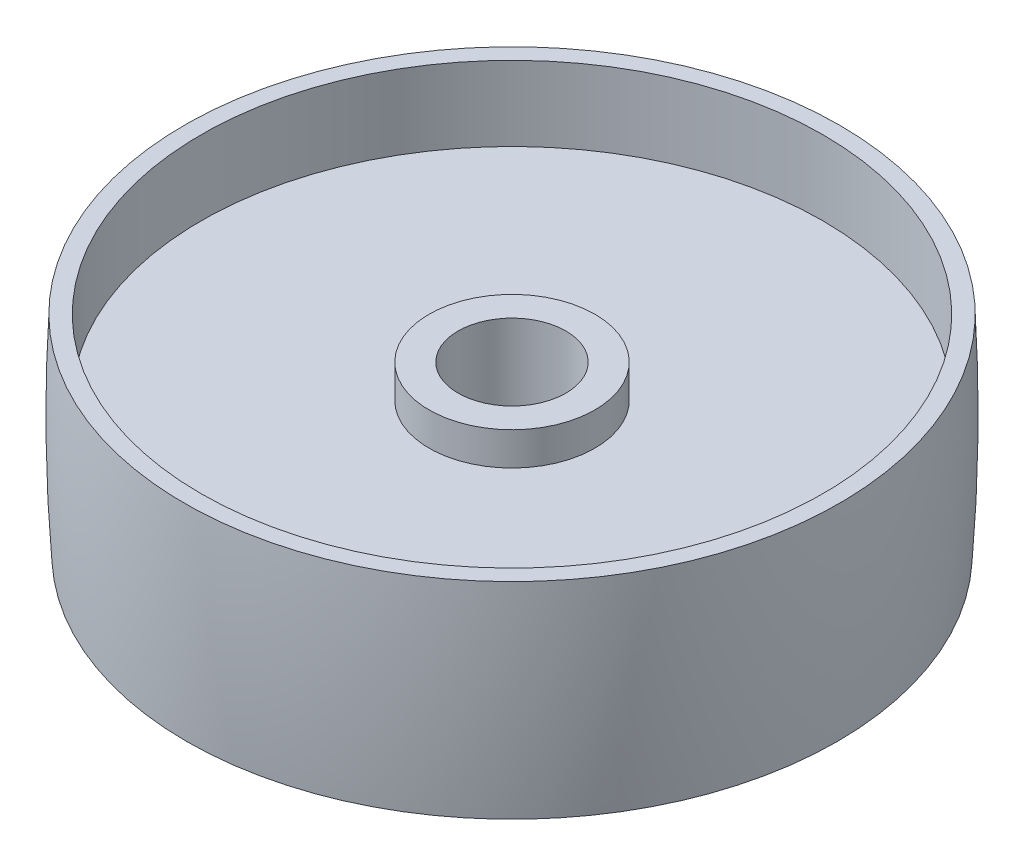
ISO-10303-21;
HEADER;
FILE_DESCRIPTION(('STEP AP214'),'2;1');
FILE_NAME('part.step','',(''),(''),'','','');
FILE_SCHEMA(('AUTOMOTIVE_DESIGN { 1 0 10303 214 1 1 1 1 }'));
ENDSEC;
DATA;
#1=APPLICATION_CONTEXT('core data for automotive mechanical design processes');
#2=APPLICATION_PROTOCOL_DEFINITION('international standard','automotive_design',2000,#1);
#3=PRODUCT_CONTEXT('',#1,'mechanical');
#4=PRODUCT('Part','Part','',(#3));
#5=PRODUCT_RELATED_PRODUCT_CATEGORY('part','',(#4));
#6=PRODUCT_DEFINITION_FORMATION('','',#4);
#7=PRODUCT_DEFINITION_CONTEXT('part definition',#1,'design');
#8=PRODUCT_DEFINITION('design','',#6,#7);
#9=PRODUCT_DEFINITION_SHAPE('','',#8);
#10=(LENGTH_UNIT() NAMED_UNIT(*) SI_UNIT(.MILLI.,.METRE.));
#11=(NAMED_UNIT(*) PLANE_ANGLE_UNIT() SI_UNIT($,.RADIAN.));
#12=(NAMED_UNIT(*) SI_UNIT($,.STERADIAN.) SOLID_ANGLE_UNIT());
#13=UNCERTAINTY_MEASURE_WITH_UNIT(LENGTH_MEASURE(1.E-05),#10,'distance_accuracy_value','');
#14=(GEOMETRIC_REPRESENTATION_CONTEXT(3) GLOBAL_UNCERTAINTY_ASSIGNED_CONTEXT((#13)) GLOBAL_UNIT_ASSIGNED_CONTEXT((#10,
#11,#12)) REPRESENTATION_CONTEXT('',''));
#15=CARTESIAN_POINT('',(0.,0.,0.));
#16=DIRECTION('',(0.,0.,1.));
#17=DIRECTION('',(1.,0.,0.));
#18=AXIS2_PLACEMENT_3D('',#15,#16,#17);
#19=CARTESIAN_POINT('',(13.,40.,0.));
#20=DIRECTION('',(0.,1.,0.));
#21=DIRECTION('',(0.,0.,1.));
#22=AXIS2_PLACEMENT_3D('',#19,#20,#21);
#23=PLANE('',#22);
#24=CARTESIAN_POINT('',(0.,40.,0.));
#25=DIRECTION('',(0.,-1.,0.));
#26=DIRECTION('',(0.,0.,-1.));
#27=AXIS2_PLACEMENT_3D('',#24,#25,#26);
#28=CIRCLE('',#27,13.);
#29=CARTESIAN_POINT('',(0.,40.,-13.));
#30=VERTEX_POINT('',#29);
#31=EDGE_CURVE('E70',#30,#30,#28,.T.);
#32=ORIENTED_EDGE('',*,*,#31,.T.);
#33=EDGE_LOOP('',(#32));
#34=FACE_BOUND('',#33,.T.);
#35=CARTESIAN_POINT('',(0.,40.,0.));
#36=DIRECTION('',(0.,-1.,0.));
#37=DIRECTION('',(0.,0.,-1.));
#38=AXIS2_PLACEMENT_3D('',#35,#36,#37);
#39=CIRCLE('',#38,20.);
#40=CARTESIAN_POINT('',(0.,40.,-20.));
#41=VERTEX_POINT('',#40);
#42=EDGE_CURVE('E10',#41,#41,#39,.T.);
#43=ORIENTED_EDGE('',*,*,#42,.F.);
#44=EDGE_LOOP('',(#43));
#45=FACE_BOUND('',#44,.T.);
#46=ADVANCED_FACE('F30',(#34,#45),#23,.T.);
#47=CARTESIAN_POINT('',(0.,0.,0.));
#48=DIRECTION('',(0.,-1.,0.));
#49=DIRECTION('',(0.,0.,-1.));
#50=AXIS2_PLACEMENT_3D('',#47,#48,#49);
#51=CYLINDRICAL_SURFACE('',#50,20.);
#52=ORIENTED_EDGE('',*,*,#42,.T.);
#53=EDGE_LOOP('',(#52));
#54=FACE_BOUND('',#53,.T.);
#55=CARTESIAN_POINT('',(0.,32.,0.));
#56=DIRECTION('',(0.,-1.,0.));
#57=DIRECTION('',(0.,0.,-1.));
#58=AXIS2_PLACEMENT_3D('',#55,#56,#57);
#59=CIRCLE('',#58,20.);
#60=CARTESIAN_POINT('',(0.,32.,-20.));
#61=VERTEX_POINT('',#60);
#62=EDGE_CURVE('E36',#61,#61,#59,.T.);
#63=ORIENTED_EDGE('',*,*,#62,.F.);
#64=EDGE_LOOP('',(#63));
#65=FACE_BOUND('',#64,.T.);
#66=ADVANCED_FACE('F88',(#54,#65),#51,.T.);
#67=CARTESIAN_POINT('',(20.,32.,0.));
#68=DIRECTION('',(0.,1.,0.));
#69=DIRECTION('',(0.,0.,1.));
#70=AXIS2_PLACEMENT_3D('',#67,#68,#69);
#71=PLANE('',#70);
#72=ORIENTED_EDGE('',*,*,#62,.T.);
#73=EDGE_LOOP('',(#72));
#74=FACE_BOUND('',#73,.T.);
#75=CARTESIAN_POINT('',(0.,32.,0.));
#76=DIRECTION('',(0.,-1.,0.));
#77=DIRECTION('',(0.,0.,-1.));
#78=AXIS2_PLACEMENT_3D('',#75,#76,#77);
#79=CIRCLE('',#78,75.);
#80=CARTESIAN_POINT('',(0.,32.,-75.));
#81=VERTEX_POINT('',#80);
#82=EDGE_CURVE('E40',#81,#81,#79,.T.);
#83=ORIENTED_EDGE('',*,*,#82,.F.);
#84=EDGE_LOOP('',(#83));
#85=FACE_BOUND('',#84,.T.);
#86=ADVANCED_FACE('F92',(#74,#85),#71,.T.);
#87=CARTESIAN_POINT('',(0.,0.,0.));
#88=DIRECTION('',(0.,-1.,0.));
#89=DIRECTION('',(0.,0.,-1.));
#90=AXIS2_PLACEMENT_3D('',#87,#88,#89);
#91=CYLINDRICAL_SURFACE('',#90,75.);
#92=ORIENTED_EDGE('',*,*,#82,.T.);
#93=EDGE_LOOP('',(#92));
#94=FACE_BOUND('',#93,.T.);
#95=CARTESIAN_POINT('',(0.,50.,0.));
#96=DIRECTION('',(0.,-1.,0.));
#97=DIRECTION('',(0.,0.,-1.));
#98=AXIS2_PLACEMENT_3D('',#95,#96,#97);
#99=CIRCLE('',#98,75.);
#100=CARTESIAN_POINT('',(0.,50.,-75.));
#101=VERTEX_POINT('',#100);
#102=EDGE_CURVE('E44',#101,#101,#99,.T.);
#103=ORIENTED_EDGE('',*,*,#102,.F.);
#104=EDGE_LOOP('',(#103));
#105=FACE_BOUND('',#104,.T.);
#106=ADVANCED_FACE('F96',(#94,#105),#91,.F.);
#107=CARTESIAN_POINT('',(75.,50.,0.));
#108=DIRECTION('',(0.,1.,0.));
#109=DIRECTION('',(0.,0.,1.));
#110=AXIS2_PLACEMENT_3D('',#107,#108,#109);
#111=PLANE('',#110);
#112=ORIENTED_EDGE('',*,*,#102,.T.);
#113=EDGE_LOOP('',(#112));
#114=FACE_BOUND('',#113,.T.);
#115=CARTESIAN_POINT('',(0.,50.,0.));
#116=DIRECTION('',(0.,-1.,0.));
#117=DIRECTION('',(0.,0.,-1.));
#118=AXIS2_PLACEMENT_3D('',#115,#116,#117);
#119=CIRCLE('',#118,79.);
#120=CARTESIAN_POINT('',(0.,50.,-79.));
#121=VERTEX_POINT('',#120);
#122=EDGE_CURVE('E49',#121,#121,#119,.T.);
#123=ORIENTED_EDGE('',*,*,#122,.F.);
#124=EDGE_LOOP('',(#123));
#125=FACE_BOUND('',#124,.T.);
#126=ADVANCED_FACE('F102',(#114,#125),#111,.T.);
#127=CARTESIAN_POINT('',(0.,29.2857864358232,0.));
#128=DIRECTION('',(0.,-1.,0.));
#129=DIRECTION('',(0.,0.,-1.));
#130=AXIS2_PLACEMENT_3D('',#127,#128,#129);
#131=DEGENERATE_TOROIDAL_SURFACE('',#130,349.828643582323,429.328643582323,.F.);
#132=ORIENTED_EDGE('',*,*,#122,.T.);
#133=EDGE_LOOP('',(#132));
#134=FACE_BOUND('',#133,.T.);
#135=CARTESIAN_POINT('',(0.,0.,0.));
#136=DIRECTION('',(0.,-1.,0.));
#137=DIRECTION('',(0.,0.,-1.));
#138=AXIS2_PLACEMENT_3D('',#135,#136,#137);
#139=CIRCLE('',#138,78.5);
#140=CARTESIAN_POINT('',(0.,0.,-78.5));
#141=VERTEX_POINT('',#140);
#142=EDGE_CURVE('E52',#141,#141,#139,.T.);
#143=ORIENTED_EDGE('',*,*,#142,.F.);
#144=EDGE_LOOP('',(#143));
#145=FACE_BOUND('',#144,.T.);
#146=ADVANCED_FACE('F106',(#134,#145),#131,.F.);
#147=CARTESIAN_POINT('',(75.,0.,0.));
#148=DIRECTION('',(0.,-1.,0.));
#149=DIRECTION('',(0.,0.,-1.));
#150=AXIS2_PLACEMENT_3D('',#147,#148,#149);
#151=PLANE('',#150);
#152=ORIENTED_EDGE('',*,*,#142,.T.);
#153=EDGE_LOOP('',(#152));
#154=FACE_BOUND('',#153,.T.);
#155=CARTESIAN_POINT('',(0.,0.,0.));
#156=DIRECTION('',(0.,-1.,0.));
#157=DIRECTION('',(0.,0.,-1.));
#158=AXIS2_PLACEMENT_3D('',#155,#156,#157);
#159=CIRCLE('',#158,75.);
#160=CARTESIAN_POINT('',(0.,0.,-75.));
#161=VERTEX_POINT('',#160);
#162=EDGE_CURVE('E55',#161,#161,#159,.T.);
#163=ORIENTED_EDGE('',*,*,#162,.F.);
#164=EDGE_LOOP('',(#163));
#165=FACE_BOUND('',#164,.T.);
#166=ADVANCED_FACE('F110',(#154,#165),#151,.T.);
#167=CARTESIAN_POINT('',(0.,0.,0.));
#168=DIRECTION('',(0.,-1.,0.));
#169=DIRECTION('',(0.,0.,-1.));
#170=AXIS2_PLACEMENT_3D('',#167,#168,#169);
#171=CYLINDRICAL_SURFACE('',#170,75.);
#172=ORIENTED_EDGE('',*,*,#162,.T.);
#173=EDGE_LOOP('',(#172));
#174=FACE_BOUND('',#173,.T.);
#175=CARTESIAN_POINT('',(0.,22.,0.));
#176=DIRECTION('',(0.,-1.,0.));
#177=DIRECTION('',(0.,0.,-1.));
#178=AXIS2_PLACEMENT_3D('',#175,#176,#177);
#179=CIRCLE('',#178,75.);
#180=CARTESIAN_POINT('',(0.,22.,-75.));
#181=VERTEX_POINT('',#180);
#182=EDGE_CURVE('E58',#181,#181,#179,.T.);
#183=ORIENTED_EDGE('',*,*,#182,.F.);
#184=EDGE_LOOP('',(#183));
#185=FACE_BOUND('',#184,.T.);
#186=ADVANCED_FACE('F114',(#174,#185),#171,.F.);
#187=CARTESIAN_POINT('',(20.,22.,0.));
#188=DIRECTION('',(0.,-1.,0.));
#189=DIRECTION('',(0.,0.,-1.));
#190=AXIS2_PLACEMENT_3D('',#187,#188,#189);
#191=PLANE('',#190);
#192=ORIENTED_EDGE('',*,*,#182,.T.);
#193=EDGE_LOOP('',(#192));
#194=FACE_BOUND('',#193,.T.);
#195=CARTESIAN_POINT('',(0.,22.,0.));
#196=DIRECTION('',(0.,-1.,0.));
#197=DIRECTION('',(0.,0.,-1.));
#198=AXIS2_PLACEMENT_3D('',#195,#196,#197);
#199=CIRCLE('',#198,20.);
#200=CARTESIAN_POINT('',(0.,22.,-20.));
#201=VERTEX_POINT('',#200);
#202=EDGE_CURVE('E61',#201,#201,#199,.T.);
#203=ORIENTED_EDGE('',*,*,#202,.F.);
#204=EDGE_LOOP('',(#203));
#205=FACE_BOUND('',#204,.T.);
#206=ADVANCED_FACE('F118',(#194,#205),#191,.T.);
#207=CARTESIAN_POINT('',(0.,0.,0.));
#208=DIRECTION('',(0.,-1.,0.));
#209=DIRECTION('',(0.,0.,-1.));
#210=AXIS2_PLACEMENT_3D('',#207,#208,#209);
#211=CYLINDRICAL_SURFACE('',#210,20.);
#212=ORIENTED_EDGE('',*,*,#202,.T.);
#213=EDGE_LOOP('',(#212));
#214=FACE_BOUND('',#213,.T.);
#215=CARTESIAN_POINT('',(0.,0.,0.));
#216=DIRECTION('',(0.,-1.,0.));
#217=DIRECTION('',(0.,0.,-1.));
#218=AXIS2_PLACEMENT_3D('',#215,#216,#217);
#219=CIRCLE('',#218,20.);
#220=CARTESIAN_POINT('',(0.,0.,-20.));
#221=VERTEX_POINT('',#220);
#222=EDGE_CURVE('E64',#221,#221,#219,.T.);
#223=ORIENTED_EDGE('',*,*,#222,.F.);
#224=EDGE_LOOP('',(#223));
#225=FACE_BOUND('',#224,.T.);
#226=ADVANCED_FACE('F84',(#214,#225),#211,.T.);
#227=CARTESIAN_POINT('',(13.,0.,0.));
#228=DIRECTION('',(0.,-1.,0.));
#229=DIRECTION('',(0.,0.,-1.));
#230=AXIS2_PLACEMENT_3D('',#227,#228,#229);
#231=PLANE('',#230);
#232=ORIENTED_EDGE('',*,*,#222,.T.);
#233=EDGE_LOOP('',(#232));
#234=FACE_BOUND('',#233,.T.);
#235=CARTESIAN_POINT('',(0.,0.,0.));
#236=DIRECTION('',(0.,-1.,0.));
#237=DIRECTION('',(0.,0.,-1.));
#238=AXIS2_PLACEMENT_3D('',#235,#236,#237);
#239=CIRCLE('',#238,13.);
#240=CARTESIAN_POINT('',(0.,0.,-13.));
#241=VERTEX_POINT('',#240);
#242=EDGE_CURVE('E67',#241,#241,#239,.T.);
#243=ORIENTED_EDGE('',*,*,#242,.F.);
#244=EDGE_LOOP('',(#243));
#245=FACE_BOUND('',#244,.T.);
#246=ADVANCED_FACE('F78',(#234,#245),#231,.T.);
#247=CARTESIAN_POINT('',(0.,0.,0.));
#248=DIRECTION('',(0.,-1.,0.));
#249=DIRECTION('',(0.,0.,-1.));
#250=AXIS2_PLACEMENT_3D('',#247,#248,#249);
#251=CYLINDRICAL_SURFACE('',#250,13.);
#252=ORIENTED_EDGE('',*,*,#242,.T.);
#253=EDGE_LOOP('',(#252));
#254=FACE_BOUND('',#253,.T.);
#255=ORIENTED_EDGE('',*,*,#31,.F.);
#256=EDGE_LOOP('',(#255));
#257=FACE_BOUND('',#256,.T.);
#258=ADVANCED_FACE('F76',(#254,#257),#251,.F.);
#259=CLOSED_SHELL('',(#46,#66,#86,#106,#126,#146,#166,#186,#206,#226,#246,#258));
#260=MANIFOLD_SOLID_BREP('B2',#259);
#261=ADVANCED_BREP_SHAPE_REPRESENTATION('',(#18,#260),#14);
#262=SHAPE_DEFINITION_REPRESENTATION(#9,#261);
ENDSEC;
END-ISO-10303-21;
